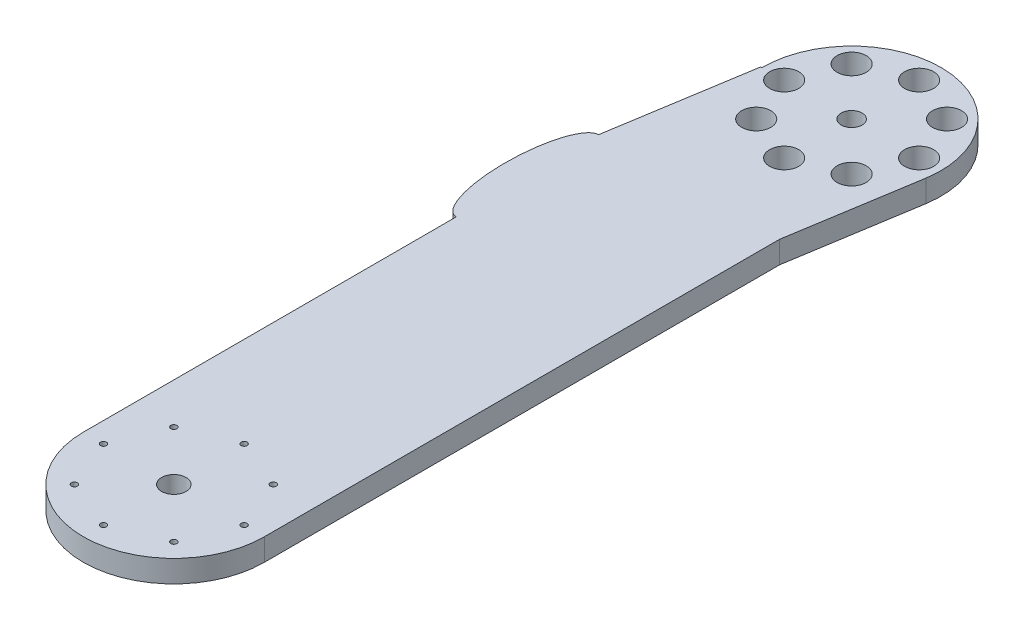
ISO-10303-21;
HEADER;
FILE_DESCRIPTION(('STEP AP214'),'2;1');
FILE_NAME('part.step','',(''),(''),'','','');
FILE_SCHEMA(('AUTOMOTIVE_DESIGN { 1 0 10303 214 1 1 1 1 }'));
ENDSEC;
DATA;
#1=APPLICATION_CONTEXT('core data for automotive mechanical design processes');
#2=APPLICATION_PROTOCOL_DEFINITION('international standard','automotive_design',2000,#1);
#3=PRODUCT_CONTEXT('',#1,'mechanical');
#4=PRODUCT('Part','Part','',(#3));
#5=PRODUCT_RELATED_PRODUCT_CATEGORY('part','',(#4));
#6=PRODUCT_DEFINITION_FORMATION('','',#4);
#7=PRODUCT_DEFINITION_CONTEXT('part definition',#1,'design');
#8=PRODUCT_DEFINITION('design','',#6,#7);
#9=PRODUCT_DEFINITION_SHAPE('','',#8);
#10=(LENGTH_UNIT() NAMED_UNIT(*) SI_UNIT(.MILLI.,.METRE.));
#11=(NAMED_UNIT(*) PLANE_ANGLE_UNIT() SI_UNIT($,.RADIAN.));
#12=(NAMED_UNIT(*) SI_UNIT($,.STERADIAN.) SOLID_ANGLE_UNIT());
#13=UNCERTAINTY_MEASURE_WITH_UNIT(LENGTH_MEASURE(1.E-05),#10,'distance_accuracy_value','');
#14=(GEOMETRIC_REPRESENTATION_CONTEXT(3) GLOBAL_UNCERTAINTY_ASSIGNED_CONTEXT((#13)) GLOBAL_UNIT_ASSIGNED_CONTEXT((#10,
#11,#12)) REPRESENTATION_CONTEXT('',''));
#15=CARTESIAN_POINT('',(0.,0.,0.));
#16=DIRECTION('',(0.,0.,1.));
#17=DIRECTION('',(1.,0.,0.));
#18=AXIS2_PLACEMENT_3D('',#15,#16,#17);
#19=CARTESIAN_POINT('',(-76.1303551224514,10.,-12.1984783831451));
#20=DIRECTION('',(-0.987404951490436,0.,-0.158213342585793));
#21=DIRECTION('',(-0.158213342585793,0.,0.987404951490436));
#22=AXIS2_PLACEMENT_3D('',#19,#20,#21);
#23=PLANE('',#22);
#24=DIRECTION('',(0.158213342585793,0.,-0.987404951490436));
#25=VECTOR('',#24,1.);
#26=CARTESIAN_POINT('',(-76.1303551224514,0.,-12.1984783831451));
#27=LINE('',#26,#25);
#28=CARTESIAN_POINT('',(-40.8421003802322,0.,-232.431468170518));
#29=VERTEX_POINT('',#28);
#30=CARTESIAN_POINT('',(-30.7509881499678,0.,-295.40981133273));
#31=VERTEX_POINT('',#30);
#32=EDGE_CURVE('E139',#29,#31,#27,.T.);
#33=ORIENTED_EDGE('',*,*,#32,.F.);
#34=DIRECTION('',(0.,-1.,0.));
#35=VECTOR('',#34,1.);
#36=CARTESIAN_POINT('',(-40.8421003802322,10.,-232.431468170518));
#37=LINE('',#36,#35);
#38=CARTESIAN_POINT('',(-40.8421003802322,10.,-232.431468170518));
#39=VERTEX_POINT('',#38);
#40=EDGE_CURVE('E11',#39,#29,#37,.T.);
#41=ORIENTED_EDGE('',*,*,#40,.F.);
#42=DIRECTION('',(0.158213342585793,0.,-0.987404951490436));
#43=VECTOR('',#42,1.);
#44=CARTESIAN_POINT('',(-76.1303551224514,10.,-12.1984783831451));
#45=LINE('',#44,#43);
#46=CARTESIAN_POINT('',(-30.7509881499678,10.,-295.40981133273));
#47=VERTEX_POINT('',#46);
#48=EDGE_CURVE('E165',#39,#47,#45,.T.);
#49=ORIENTED_EDGE('',*,*,#48,.T.);
#50=DIRECTION('',(0.,-1.,0.));
#51=VECTOR('',#50,1.);
#52=CARTESIAN_POINT('',(-30.7509881499678,10.,-295.40981133273));
#53=LINE('',#52,#51);
#54=EDGE_CURVE('E93',#47,#31,#53,.T.);
#55=ORIENTED_EDGE('',*,*,#54,.T.);
#56=EDGE_LOOP('',(#33,#41,#49,#55));
#57=FACE_BOUND('',#56,.T.);
#58=ADVANCED_FACE('F41',(#57),#23,.T.);
#59=CARTESIAN_POINT('',(-40.8421003802319,10.,-200.333095689061));
#60=DIRECTION('',(0.,1.,0.));
#61=DIRECTION('',(0.,0.,-1.));
#62=AXIS2_PLACEMENT_3D('',#59,#60,#61);
#63=ELLIPSE('',#62,32.0983724814568,10.0911122302643);
#64=DIRECTION('',(0.,-1.,0.));
#65=VECTOR('',#64,1.);
#66=SURFACE_OF_LINEAR_EXTRUSION('',#63,#65);
#67=CARTESIAN_POINT('',(-40.8421003802319,0.,-200.333095689061));
#68=DIRECTION('',(0.,1.,0.));
#69=DIRECTION('',(0.,0.,-1.));
#70=AXIS2_PLACEMENT_3D('',#67,#68,#69);
#71=ELLIPSE('',#70,32.0983724814568,10.0911122302643);
#72=CARTESIAN_POINT('',(-40.8421003802319,0.,-168.234723207604));
#73=VERTEX_POINT('',#72);
#74=EDGE_CURVE('E143',#29,#73,#71,.T.);
#75=ORIENTED_EDGE('',*,*,#74,.T.);
#76=DIRECTION('',(0.,-1.,0.));
#77=VECTOR('',#76,1.);
#78=CARTESIAN_POINT('',(-40.8421003802319,10.,-168.234723207604));
#79=LINE('',#78,#77);
#80=CARTESIAN_POINT('',(-40.8421003802319,10.,-168.234723207604));
#81=VERTEX_POINT('',#80);
#82=EDGE_CURVE('E50',#81,#73,#79,.T.);
#83=ORIENTED_EDGE('',*,*,#82,.F.);
#84=EDGE_CURVE('E206',#39,#81,#63,.T.);
#85=ORIENTED_EDGE('',*,*,#84,.F.);
#86=ORIENTED_EDGE('',*,*,#40,.T.);
#87=EDGE_LOOP('',(#75,#83,#85,#86));
#88=FACE_BOUND('',#87,.T.);
#89=ADVANCED_FACE('F188',(#88),#66,.F.);
#90=CARTESIAN_POINT('',(-40.8421003802319,10.,0.));
#91=DIRECTION('',(-1.,0.,0.));
#92=DIRECTION('',(0.,0.,1.));
#93=AXIS2_PLACEMENT_3D('',#90,#91,#92);
#94=PLANE('',#93);
#95=DIRECTION('',(0.,0.,-1.));
#96=VECTOR('',#95,1.);
#97=CARTESIAN_POINT('',(-40.8421003802319,0.,0.));
#98=LINE('',#97,#96);
#99=CARTESIAN_POINT('',(-40.8421003802319,0.,0.));
#100=VERTEX_POINT('',#99);
#101=EDGE_CURVE('E148',#100,#73,#98,.T.);
#102=ORIENTED_EDGE('',*,*,#101,.F.);
#103=DIRECTION('',(0.,-1.,0.));
#104=VECTOR('',#103,1.);
#105=CARTESIAN_POINT('',(-40.8421003802319,10.,0.));
#106=LINE('',#105,#104);
#107=CARTESIAN_POINT('',(-40.8421003802319,10.,0.));
#108=VERTEX_POINT('',#107);
#109=EDGE_CURVE('E176',#108,#100,#106,.T.);
#110=ORIENTED_EDGE('',*,*,#109,.F.);
#111=DIRECTION('',(0.,0.,-1.));
#112=VECTOR('',#111,1.);
#113=CARTESIAN_POINT('',(-40.8421003802319,10.,0.));
#114=LINE('',#113,#112);
#115=EDGE_CURVE('E185',#108,#81,#114,.T.);
#116=ORIENTED_EDGE('',*,*,#115,.T.);
#117=ORIENTED_EDGE('',*,*,#82,.T.);
#118=EDGE_LOOP('',(#102,#110,#116,#117));
#119=FACE_BOUND('',#118,.T.);
#120=ADVANCED_FACE('F183',(#119),#94,.T.);
#121=CARTESIAN_POINT('',(0.,10.,0.));
#122=DIRECTION('',(0.,-1.,0.));
#123=DIRECTION('',(0.,0.,-1.));
#124=AXIS2_PLACEMENT_3D('',#121,#122,#123);
#125=CYLINDRICAL_SURFACE('',#124,40.8421003802319);
#126=CARTESIAN_POINT('',(0.,0.,0.));
#127=DIRECTION('',(0.,1.,0.));
#128=DIRECTION('',(0.,0.,1.));
#129=AXIS2_PLACEMENT_3D('',#126,#127,#128);
#130=CIRCLE('',#129,40.8421003802319);
#131=CARTESIAN_POINT('',(40.8421003802319,0.,0.));
#132=VERTEX_POINT('',#131);
#133=EDGE_CURVE('E152',#100,#132,#130,.T.);
#134=ORIENTED_EDGE('',*,*,#133,.T.);
#135=DIRECTION('',(0.,-1.,0.));
#136=VECTOR('',#135,1.);
#137=CARTESIAN_POINT('',(40.8421003802319,10.,0.));
#138=LINE('',#137,#136);
#139=CARTESIAN_POINT('',(40.8421003802319,10.,0.));
#140=VERTEX_POINT('',#139);
#141=EDGE_CURVE('E172',#140,#132,#138,.T.);
#142=ORIENTED_EDGE('',*,*,#141,.F.);
#143=CARTESIAN_POINT('',(0.,10.,0.));
#144=DIRECTION('',(0.,1.,0.));
#145=DIRECTION('',(0.,0.,1.));
#146=AXIS2_PLACEMENT_3D('',#143,#144,#145);
#147=CIRCLE('',#146,40.8421003802319);
#148=EDGE_CURVE('E200',#108,#140,#147,.T.);
#149=ORIENTED_EDGE('',*,*,#148,.F.);
#150=ORIENTED_EDGE('',*,*,#109,.T.);
#151=EDGE_LOOP('',(#134,#142,#149,#150));
#152=FACE_BOUND('',#151,.T.);
#153=ADVANCED_FACE('F195',(#152),#125,.T.);
#154=CARTESIAN_POINT('',(40.8421003802319,10.,0.));
#155=DIRECTION('',(-1.,0.,0.));
#156=DIRECTION('',(0.,0.,1.));
#157=AXIS2_PLACEMENT_3D('',#154,#155,#156);
#158=PLANE('',#157);
#159=DIRECTION('',(0.,0.,-1.));
#160=VECTOR('',#159,1.);
#161=CARTESIAN_POINT('',(40.8421003802319,0.,0.));
#162=LINE('',#161,#160);
#163=CARTESIAN_POINT('',(40.8421003802319,0.,-232.431468170518));
#164=VERTEX_POINT('',#163);
#165=EDGE_CURVE('E155',#132,#164,#162,.T.);
#166=ORIENTED_EDGE('',*,*,#165,.T.);
#167=DIRECTION('',(0.,-1.,0.));
#168=VECTOR('',#167,1.);
#169=CARTESIAN_POINT('',(40.8421003802319,10.,-232.431468170518));
#170=LINE('',#169,#168);
#171=CARTESIAN_POINT('',(40.8421003802319,10.,-232.431468170518));
#172=VERTEX_POINT('',#171);
#173=EDGE_CURVE('E129',#172,#164,#170,.T.);
#174=ORIENTED_EDGE('',*,*,#173,.F.);
#175=DIRECTION('',(0.,0.,-1.));
#176=VECTOR('',#175,1.);
#177=CARTESIAN_POINT('',(40.8421003802319,10.,0.));
#178=LINE('',#177,#176);
#179=EDGE_CURVE('E118',#140,#172,#178,.T.);
#180=ORIENTED_EDGE('',*,*,#179,.F.);
#181=ORIENTED_EDGE('',*,*,#141,.T.);
#182=EDGE_LOOP('',(#166,#174,#180,#181));
#183=FACE_BOUND('',#182,.T.);
#184=ADVANCED_FACE('F198',(#183),#158,.F.);
#185=CARTESIAN_POINT('',(3.50917068928697,10.,0.562279562825913));
#186=DIRECTION('',(-0.987404951490436,0.,-0.158213342585793));
#187=DIRECTION('',(-0.158213342585793,0.,0.987404951490436));
#188=AXIS2_PLACEMENT_3D('',#185,#186,#187);
#189=PLANE('',#188);
#190=DIRECTION('',(0.158213342585793,0.,-0.987404951490436));
#191=VECTOR('',#190,1.);
#192=CARTESIAN_POINT('',(3.50917068928697,0.,0.562279562825913));
#193=LINE('',#192,#191);
#194=CARTESIAN_POINT('',(49.94474208855,0.,-289.240795042319));
#195=VERTEX_POINT('',#194);
#196=EDGE_CURVE('E127',#164,#195,#193,.T.);
#197=ORIENTED_EDGE('',*,*,#196,.T.);
#198=DIRECTION('',(0.,-1.,0.));
#199=VECTOR('',#198,1.);
#200=CARTESIAN_POINT('',(49.94474208855,10.,-289.240795042319));
#201=LINE('',#200,#199);
#202=CARTESIAN_POINT('',(49.94474208855,10.,-289.240795042319));
#203=VERTEX_POINT('',#202);
#204=EDGE_CURVE('E124',#203,#195,#201,.T.);
#205=ORIENTED_EDGE('',*,*,#204,.F.);
#206=DIRECTION('',(0.158213342585793,0.,-0.987404951490436));
#207=VECTOR('',#206,1.);
#208=CARTESIAN_POINT('',(3.50917068928697,10.,0.562279562825913));
#209=LINE('',#208,#207);
#210=EDGE_CURVE('E112',#172,#203,#209,.T.);
#211=ORIENTED_EDGE('',*,*,#210,.F.);
#212=ORIENTED_EDGE('',*,*,#173,.T.);
#213=EDGE_LOOP('',(#197,#205,#211,#212));
#214=FACE_BOUND('',#213,.T.);
#215=ADVANCED_FACE('F125',(#214),#189,.F.);
#216=CARTESIAN_POINT('',(10.1249791826809,10.,-295.621174015304));
#217=DIRECTION('',(0.,-1.,0.));
#218=DIRECTION('',(0.,0.,-1.));
#219=AXIS2_PLACEMENT_3D('',#216,#217,#218);
#220=CYLINDRICAL_SURFACE('',#219,40.3276921447104);
#221=CARTESIAN_POINT('',(10.1249791826809,0.,-295.621174015304));
#222=DIRECTION('',(0.,1.,0.));
#223=DIRECTION('',(0.,0.,1.));
#224=AXIS2_PLACEMENT_3D('',#221,#222,#223);
#225=CIRCLE('',#224,40.3276921447104);
#226=CARTESIAN_POINT('',(-30.2021738423287,0.,-295.412649158276));
#227=VERTEX_POINT('',#226);
#228=EDGE_CURVE('E86',#195,#227,#225,.T.);
#229=ORIENTED_EDGE('',*,*,#228,.T.);
#230=DIRECTION('',(0.,-1.,0.));
#231=VECTOR('',#230,1.);
#232=CARTESIAN_POINT('',(-30.2021738423287,10.,-295.412649158276));
#233=LINE('',#232,#231);
#234=CARTESIAN_POINT('',(-30.2021738423287,10.,-295.412649158276));
#235=VERTEX_POINT('',#234);
#236=EDGE_CURVE('E130',#235,#227,#233,.T.);
#237=ORIENTED_EDGE('',*,*,#236,.F.);
#238=CARTESIAN_POINT('',(10.1249791826809,10.,-295.621174015304));
#239=DIRECTION('',(0.,1.,0.));
#240=DIRECTION('',(0.,0.,1.));
#241=AXIS2_PLACEMENT_3D('',#238,#239,#240);
#242=CIRCLE('',#241,40.3276921447104);
#243=EDGE_CURVE('E116',#203,#235,#242,.T.);
#244=ORIENTED_EDGE('',*,*,#243,.F.);
#245=ORIENTED_EDGE('',*,*,#204,.T.);
#246=EDGE_LOOP('',(#229,#237,#244,#245));
#247=FACE_BOUND('',#246,.T.);
#248=ADVANCED_FACE('F132',(#247),#220,.T.);
#249=CARTESIAN_POINT('',(-1.52829528790367,10.,-295.560916912816));
#250=DIRECTION('',(0.00517076098183433,0.,0.999986631526076));
#251=DIRECTION('',(0.999986631526076,0.,-0.00517076098183433));
#252=AXIS2_PLACEMENT_3D('',#249,#250,#251);
#253=PLANE('',#252);
#254=DIRECTION('',(-0.999986631526076,0.,0.00517076098183433));
#255=VECTOR('',#254,1.);
#256=CARTESIAN_POINT('',(-1.52829528790367,0.,-295.560916912816));
#257=LINE('',#256,#255);
#258=EDGE_CURVE('E162',#227,#31,#257,.T.);
#259=ORIENTED_EDGE('',*,*,#258,.T.);
#260=ORIENTED_EDGE('',*,*,#54,.F.);
#261=DIRECTION('',(-0.999986631526076,0.,0.00517076098183433));
#262=VECTOR('',#261,1.);
#263=CARTESIAN_POINT('',(-1.52829528790367,10.,-295.560916912816));
#264=LINE('',#263,#262);
#265=EDGE_CURVE('E58',#235,#47,#264,.T.);
#266=ORIENTED_EDGE('',*,*,#265,.F.);
#267=ORIENTED_EDGE('',*,*,#236,.T.);
#268=EDGE_LOOP('',(#259,#260,#266,#267));
#269=FACE_BOUND('',#268,.T.);
#270=ADVANCED_FACE('F223',(#269),#253,.F.);
#271=CARTESIAN_POINT('',(0.,10.,0.));
#272=DIRECTION('',(0.,1.,0.));
#273=DIRECTION('',(0.,0.,1.));
#274=AXIS2_PLACEMENT_3D('',#271,#272,#273);
#275=PLANE('',#274);
#276=CARTESIAN_POINT('',(10.1249791826809,10.,-295.621174015304));
#277=DIRECTION('',(0.,1.,0.));
#278=DIRECTION('',(0.,0.,1.));
#279=AXIS2_PLACEMENT_3D('',#276,#277,#278);
#280=CIRCLE('',#279,4.72103877444645);
#281=CARTESIAN_POINT('',(10.1249791826809,10.,-290.900135240858));
#282=VERTEX_POINT('',#281);
#283=EDGE_CURVE('E451',#282,#282,#280,.T.);
#284=ORIENTED_EDGE('',*,*,#283,.F.);
#285=EDGE_LOOP('',(#284));
#286=FACE_BOUND('',#285,.T.);
#287=CARTESIAN_POINT('',(10.1249791826824,10.,-265.190659660924));
#288=DIRECTION('',(0.,1.,0.));
#289=DIRECTION('',(0.,0.,1.));
#290=AXIS2_PLACEMENT_3D('',#287,#288,#289);
#291=CIRCLE('',#290,6.56125005550479);
#292=CARTESIAN_POINT('',(10.1249791826824,10.,-258.62940960542));
#293=VERTEX_POINT('',#292);
#294=EDGE_CURVE('E391',#293,#293,#291,.T.);
#295=ORIENTED_EDGE('',*,*,#294,.F.);
#296=EDGE_LOOP('',(#295));
#297=FACE_BOUND('',#296,.T.);
#298=CARTESIAN_POINT('',(31.6426022376587,10.,-274.103550960328));
#299=DIRECTION('',(0.,1.,0.));
#300=DIRECTION('',(0.,0.,1.));
#301=AXIS2_PLACEMENT_3D('',#298,#299,#300);
#302=CIRCLE('',#301,6.5612500555048);
#303=CARTESIAN_POINT('',(31.6426022376587,10.,-267.542300904823));
#304=VERTEX_POINT('',#303);
#305=EDGE_CURVE('E399',#304,#304,#302,.T.);
#306=ORIENTED_EDGE('',*,*,#305,.F.);
#307=EDGE_LOOP('',(#306));
#308=FACE_BOUND('',#307,.T.);
#309=CARTESIAN_POINT('',(40.5554935370615,10.,-295.621174015305));
#310=DIRECTION('',(0.,1.,0.));
#311=DIRECTION('',(0.,0.,1.));
#312=AXIS2_PLACEMENT_3D('',#309,#310,#311);
#313=CIRCLE('',#312,6.56125005550481);
#314=CARTESIAN_POINT('',(40.5554935370615,10.,-289.0599239598));
#315=VERTEX_POINT('',#314);
#316=EDGE_CURVE('E407',#315,#315,#313,.T.);
#317=ORIENTED_EDGE('',*,*,#316,.F.);
#318=EDGE_LOOP('',(#317));
#319=FACE_BOUND('',#318,.T.);
#320=CARTESIAN_POINT('',(31.6426022376576,10.,-317.138797070281));
#321=DIRECTION('',(0.,1.,0.));
#322=DIRECTION('',(0.,0.,1.));
#323=AXIS2_PLACEMENT_3D('',#320,#321,#322);
#324=CIRCLE('',#323,6.5612500555048);
#325=CARTESIAN_POINT('',(31.6426022376576,10.,-310.577547014776));
#326=VERTEX_POINT('',#325);
#327=EDGE_CURVE('E415',#326,#326,#324,.T.);
#328=ORIENTED_EDGE('',*,*,#327,.F.);
#329=EDGE_LOOP('',(#328));
#330=FACE_BOUND('',#329,.T.);
#331=CARTESIAN_POINT('',(10.1249791826809,10.,-326.051688369684));
#332=DIRECTION('',(0.,1.,0.));
#333=DIRECTION('',(0.,0.,1.));
#334=AXIS2_PLACEMENT_3D('',#331,#332,#333);
#335=CIRCLE('',#334,6.56125005550479);
#336=CARTESIAN_POINT('',(10.1249791826809,10.,-319.490438314179));
#337=VERTEX_POINT('',#336);
#338=EDGE_CURVE('E423',#337,#337,#335,.T.);
#339=ORIENTED_EDGE('',*,*,#338,.F.);
#340=EDGE_LOOP('',(#339));
#341=FACE_BOUND('',#340,.T.);
#342=CARTESIAN_POINT('',(-20.3055351716979,10.,-295.621174015304));
#343=DIRECTION('',(0.,1.,0.));
#344=DIRECTION('',(0.,0.,1.));
#345=AXIS2_PLACEMENT_3D('',#342,#343,#344);
#346=CIRCLE('',#345,6.56125005550479);
#347=CARTESIAN_POINT('',(-20.3055351716979,10.,-289.059923959799));
#348=VERTEX_POINT('',#347);
#349=EDGE_CURVE('E431',#348,#348,#346,.T.);
#350=ORIENTED_EDGE('',*,*,#349,.F.);
#351=EDGE_LOOP('',(#350));
#352=FACE_BOUND('',#351,.T.);
#353=CARTESIAN_POINT('',(-11.3926438722943,10.,-274.103550960327));
#354=DIRECTION('',(0.,1.,0.));
#355=DIRECTION('',(0.,0.,1.));
#356=AXIS2_PLACEMENT_3D('',#353,#354,#355);
#357=CIRCLE('',#356,6.56125005550478);
#358=CARTESIAN_POINT('',(-11.3926438722943,10.,-267.542300904823));
#359=VERTEX_POINT('',#358);
#360=EDGE_CURVE('E439',#359,#359,#357,.T.);
#361=ORIENTED_EDGE('',*,*,#360,.F.);
#362=EDGE_LOOP('',(#361));
#363=FACE_BOUND('',#362,.T.);
#364=CARTESIAN_POINT('',(-11.392643872295,10.,-317.13879707028));
#365=DIRECTION('',(0.,1.,0.));
#366=DIRECTION('',(0.,0.,1.));
#367=AXIS2_PLACEMENT_3D('',#364,#365,#366);
#368=CIRCLE('',#367,6.56125005550482);
#369=CARTESIAN_POINT('',(-11.392643872295,10.,-310.577547014775));
#370=VERTEX_POINT('',#369);
#371=EDGE_CURVE('E387',#370,#370,#368,.T.);
#372=ORIENTED_EDGE('',*,*,#371,.F.);
#373=EDGE_LOOP('',(#372));
#374=FACE_BOUND('',#373,.T.);
#375=CARTESIAN_POINT('',(0.,10.,0.));
#376=DIRECTION('',(0.,1.,0.));
#377=DIRECTION('',(0.,0.,1.));
#378=AXIS2_PLACEMENT_3D('',#375,#376,#377);
#379=CIRCLE('',#378,5.5);
#380=CARTESIAN_POINT('',(0.,10.,5.5));
#381=VERTEX_POINT('',#380);
#382=EDGE_CURVE('E379',#381,#381,#379,.T.);
#383=ORIENTED_EDGE('',*,*,#382,.F.);
#384=EDGE_LOOP('',(#383));
#385=FACE_BOUND('',#384,.T.);
#386=CARTESIAN_POINT('',(0.,10.,-31.7167556330264));
#387=DIRECTION('',(0.,1.,0.));
#388=DIRECTION('',(0.,0.,1.));
#389=AXIS2_PLACEMENT_3D('',#386,#387,#388);
#390=CIRCLE('',#389,1.35);
#391=CARTESIAN_POINT('',(0.,10.,-30.3667556330264));
#392=VERTEX_POINT('',#391);
#393=EDGE_CURVE('E316',#392,#392,#390,.F.);
#394=ORIENTED_EDGE('',*,*,#393,.T.);
#395=EDGE_LOOP('',(#394));
#396=FACE_BOUND('',#395,.T.);
#397=CARTESIAN_POINT('',(-22.4271329853496,10.,-22.4271329853496));
#398=DIRECTION('',(0.,1.,0.));
#399=DIRECTION('',(0.,0.,1.));
#400=AXIS2_PLACEMENT_3D('',#397,#398,#399);
#401=CIRCLE('',#400,1.35);
#402=CARTESIAN_POINT('',(-22.4271329853496,10.,-21.0771329853496));
#403=VERTEX_POINT('',#402);
#404=EDGE_CURVE('E324',#403,#403,#401,.F.);
#405=ORIENTED_EDGE('',*,*,#404,.T.);
#406=EDGE_LOOP('',(#405));
#407=FACE_BOUND('',#406,.T.);
#408=CARTESIAN_POINT('',(-31.7167556330264,10.,1.10738460421359E-13));
#409=DIRECTION('',(0.,1.,0.));
#410=DIRECTION('',(0.,0.,1.));
#411=AXIS2_PLACEMENT_3D('',#408,#409,#410);
#412=CIRCLE('',#411,1.35);
#413=CARTESIAN_POINT('',(-31.7167556330264,10.,1.35000000000011));
#414=VERTEX_POINT('',#413);
#415=EDGE_CURVE('E332',#414,#414,#412,.F.);
#416=ORIENTED_EDGE('',*,*,#415,.T.);
#417=EDGE_LOOP('',(#416));
#418=FACE_BOUND('',#417,.T.);
#419=CARTESIAN_POINT('',(-22.4271329853495,10.,22.4271329853497));
#420=DIRECTION('',(0.,1.,0.));
#421=DIRECTION('',(0.,0.,1.));
#422=AXIS2_PLACEMENT_3D('',#419,#420,#421);
#423=CIRCLE('',#422,1.35);
#424=CARTESIAN_POINT('',(-22.4271329853495,10.,23.7771329853497));
#425=VERTEX_POINT('',#424);
#426=EDGE_CURVE('E340',#425,#425,#423,.F.);
#427=ORIENTED_EDGE('',*,*,#426,.T.);
#428=EDGE_LOOP('',(#427));
#429=FACE_BOUND('',#428,.T.);
#430=CARTESIAN_POINT('',(2.21476920842719E-13,10.,31.7167556330264));
#431=DIRECTION('',(0.,1.,0.));
#432=DIRECTION('',(0.,0.,1.));
#433=AXIS2_PLACEMENT_3D('',#430,#431,#432);
#434=CIRCLE('',#433,1.35);
#435=CARTESIAN_POINT('',(2.21476920842719E-13,10.,33.0667556330264));
#436=VERTEX_POINT('',#435);
#437=EDGE_CURVE('E348',#436,#436,#434,.F.);
#438=ORIENTED_EDGE('',*,*,#437,.T.);
#439=EDGE_LOOP('',(#438));
#440=FACE_BOUND('',#439,.T.);
#441=CARTESIAN_POINT('',(22.4271329853498,10.,22.4271329853494));
#442=DIRECTION('',(0.,1.,0.));
#443=DIRECTION('',(0.,0.,1.));
#444=AXIS2_PLACEMENT_3D('',#441,#442,#443);
#445=CIRCLE('',#444,1.35);
#446=CARTESIAN_POINT('',(22.4271329853498,10.,23.7771329853494));
#447=VERTEX_POINT('',#446);
#448=EDGE_CURVE('E356',#447,#447,#445,.F.);
#449=ORIENTED_EDGE('',*,*,#448,.T.);
#450=EDGE_LOOP('',(#449));
#451=FACE_BOUND('',#450,.T.);
#452=CARTESIAN_POINT('',(31.7167556330264,10.,-3.32215381264078E-13));
#453=DIRECTION('',(0.,1.,0.));
#454=DIRECTION('',(0.,0.,1.));
#455=AXIS2_PLACEMENT_3D('',#452,#453,#454);
#456=CIRCLE('',#455,1.35);
#457=CARTESIAN_POINT('',(31.7167556330264,10.,1.34999999999967));
#458=VERTEX_POINT('',#457);
#459=EDGE_CURVE('E364',#458,#458,#456,.F.);
#460=ORIENTED_EDGE('',*,*,#459,.T.);
#461=EDGE_LOOP('',(#460));
#462=FACE_BOUND('',#461,.T.);
#463=CARTESIAN_POINT('',(22.4271329853493,10.,-22.4271329853499));
#464=DIRECTION('',(0.,1.,0.));
#465=DIRECTION('',(0.,0.,1.));
#466=AXIS2_PLACEMENT_3D('',#463,#464,#465);
#467=CIRCLE('',#466,1.35);
#468=CARTESIAN_POINT('',(22.4271329853493,10.,-21.0771329853499));
#469=VERTEX_POINT('',#468);
#470=EDGE_CURVE('E372',#469,#469,#467,.F.);
#471=ORIENTED_EDGE('',*,*,#470,.T.);
#472=EDGE_LOOP('',(#471));
#473=FACE_BOUND('',#472,.T.);
#474=ORIENTED_EDGE('',*,*,#48,.F.);
#475=ORIENTED_EDGE('',*,*,#84,.T.);
#476=ORIENTED_EDGE('',*,*,#115,.F.);
#477=ORIENTED_EDGE('',*,*,#148,.T.);
#478=ORIENTED_EDGE('',*,*,#179,.T.);
#479=ORIENTED_EDGE('',*,*,#210,.T.);
#480=ORIENTED_EDGE('',*,*,#243,.T.);
#481=ORIENTED_EDGE('',*,*,#265,.T.);
#482=EDGE_LOOP('',(#474,#475,#476,#477,#478,#479,#480,#481));
#483=FACE_BOUND('',#482,.T.);
#484=ADVANCED_FACE('F114',(#286,#297,#308,#319,#330,#341,#352,#363,#374,#385,#396,#407,#418,
#429,#440,#451,#462,#473,#483),#275,.T.);
#485=CARTESIAN_POINT('',(0.,0.,0.));
#486=DIRECTION('',(0.,1.,0.));
#487=DIRECTION('',(0.,0.,1.));
#488=AXIS2_PLACEMENT_3D('',#485,#486,#487);
#489=PLANE('',#488);
#490=CARTESIAN_POINT('',(10.1249791826809,0.,-295.621174015304));
#491=DIRECTION('',(0.,1.,0.));
#492=DIRECTION('',(0.,0.,1.));
#493=AXIS2_PLACEMENT_3D('',#490,#491,#492);
#494=CIRCLE('',#493,4.72103877444645);
#495=CARTESIAN_POINT('',(10.1249791826809,0.,-290.900135240858));
#496=VERTEX_POINT('',#495);
#497=EDGE_CURVE('E447',#496,#496,#494,.F.);
#498=ORIENTED_EDGE('',*,*,#497,.F.);
#499=EDGE_LOOP('',(#498));
#500=FACE_BOUND('',#499,.T.);
#501=CARTESIAN_POINT('',(10.1249791826824,0.,-265.190659660924));
#502=DIRECTION('',(0.,1.,0.));
#503=DIRECTION('',(0.,0.,1.));
#504=AXIS2_PLACEMENT_3D('',#501,#502,#503);
#505=CIRCLE('',#504,6.56125005550479);
#506=CARTESIAN_POINT('',(10.1249791826824,0.,-258.62940960542));
#507=VERTEX_POINT('',#506);
#508=EDGE_CURVE('E395',#507,#507,#505,.F.);
#509=ORIENTED_EDGE('',*,*,#508,.F.);
#510=EDGE_LOOP('',(#509));
#511=FACE_BOUND('',#510,.T.);
#512=CARTESIAN_POINT('',(31.6426022376587,0.,-274.103550960328));
#513=DIRECTION('',(0.,1.,0.));
#514=DIRECTION('',(0.,0.,1.));
#515=AXIS2_PLACEMENT_3D('',#512,#513,#514);
#516=CIRCLE('',#515,6.5612500555048);
#517=CARTESIAN_POINT('',(31.6426022376587,0.,-267.542300904823));
#518=VERTEX_POINT('',#517);
#519=EDGE_CURVE('E403',#518,#518,#516,.F.);
#520=ORIENTED_EDGE('',*,*,#519,.F.);
#521=EDGE_LOOP('',(#520));
#522=FACE_BOUND('',#521,.T.);
#523=CARTESIAN_POINT('',(40.5554935370615,0.,-295.621174015305));
#524=DIRECTION('',(0.,1.,0.));
#525=DIRECTION('',(0.,0.,1.));
#526=AXIS2_PLACEMENT_3D('',#523,#524,#525);
#527=CIRCLE('',#526,6.56125005550481);
#528=CARTESIAN_POINT('',(40.5554935370615,0.,-289.0599239598));
#529=VERTEX_POINT('',#528);
#530=EDGE_CURVE('E411',#529,#529,#527,.F.);
#531=ORIENTED_EDGE('',*,*,#530,.F.);
#532=EDGE_LOOP('',(#531));
#533=FACE_BOUND('',#532,.T.);
#534=CARTESIAN_POINT('',(31.6426022376576,0.,-317.138797070281));
#535=DIRECTION('',(0.,1.,0.));
#536=DIRECTION('',(0.,0.,1.));
#537=AXIS2_PLACEMENT_3D('',#534,#535,#536);
#538=CIRCLE('',#537,6.5612500555048);
#539=CARTESIAN_POINT('',(31.6426022376576,0.,-310.577547014776));
#540=VERTEX_POINT('',#539);
#541=EDGE_CURVE('E419',#540,#540,#538,.F.);
#542=ORIENTED_EDGE('',*,*,#541,.F.);
#543=EDGE_LOOP('',(#542));
#544=FACE_BOUND('',#543,.T.);
#545=CARTESIAN_POINT('',(10.1249791826809,0.,-326.051688369684));
#546=DIRECTION('',(0.,1.,0.));
#547=DIRECTION('',(0.,0.,1.));
#548=AXIS2_PLACEMENT_3D('',#545,#546,#547);
#549=CIRCLE('',#548,6.56125005550479);
#550=CARTESIAN_POINT('',(10.1249791826809,0.,-319.490438314179));
#551=VERTEX_POINT('',#550);
#552=EDGE_CURVE('E427',#551,#551,#549,.F.);
#553=ORIENTED_EDGE('',*,*,#552,.F.);
#554=EDGE_LOOP('',(#553));
#555=FACE_BOUND('',#554,.T.);
#556=CARTESIAN_POINT('',(-20.3055351716979,0.,-295.621174015304));
#557=DIRECTION('',(0.,1.,0.));
#558=DIRECTION('',(0.,0.,1.));
#559=AXIS2_PLACEMENT_3D('',#556,#557,#558);
#560=CIRCLE('',#559,6.56125005550479);
#561=CARTESIAN_POINT('',(-20.3055351716979,0.,-289.059923959799));
#562=VERTEX_POINT('',#561);
#563=EDGE_CURVE('E435',#562,#562,#560,.F.);
#564=ORIENTED_EDGE('',*,*,#563,.F.);
#565=EDGE_LOOP('',(#564));
#566=FACE_BOUND('',#565,.T.);
#567=CARTESIAN_POINT('',(-11.3926438722943,0.,-274.103550960327));
#568=DIRECTION('',(0.,1.,0.));
#569=DIRECTION('',(0.,0.,1.));
#570=AXIS2_PLACEMENT_3D('',#567,#568,#569);
#571=CIRCLE('',#570,6.56125005550478);
#572=CARTESIAN_POINT('',(-11.3926438722943,0.,-267.542300904823));
#573=VERTEX_POINT('',#572);
#574=EDGE_CURVE('E443',#573,#573,#571,.F.);
#575=ORIENTED_EDGE('',*,*,#574,.F.);
#576=EDGE_LOOP('',(#575));
#577=FACE_BOUND('',#576,.T.);
#578=CARTESIAN_POINT('',(-11.392643872295,0.,-317.13879707028));
#579=DIRECTION('',(0.,1.,0.));
#580=DIRECTION('',(0.,0.,1.));
#581=AXIS2_PLACEMENT_3D('',#578,#579,#580);
#582=CIRCLE('',#581,6.56125005550482);
#583=CARTESIAN_POINT('',(-11.392643872295,0.,-310.577547014775));
#584=VERTEX_POINT('',#583);
#585=EDGE_CURVE('E383',#584,#584,#582,.F.);
#586=ORIENTED_EDGE('',*,*,#585,.F.);
#587=EDGE_LOOP('',(#586));
#588=FACE_BOUND('',#587,.T.);
#589=CARTESIAN_POINT('',(0.,0.,0.));
#590=DIRECTION('',(0.,1.,0.));
#591=DIRECTION('',(0.,0.,1.));
#592=AXIS2_PLACEMENT_3D('',#589,#590,#591);
#593=CIRCLE('',#592,5.5);
#594=CARTESIAN_POINT('',(0.,0.,5.5));
#595=VERTEX_POINT('',#594);
#596=EDGE_CURVE('E376',#595,#595,#593,.F.);
#597=ORIENTED_EDGE('',*,*,#596,.F.);
#598=EDGE_LOOP('',(#597));
#599=FACE_BOUND('',#598,.T.);
#600=CARTESIAN_POINT('',(0.,0.,-31.7167556330264));
#601=DIRECTION('',(0.,-1.,0.));
#602=DIRECTION('',(0.,0.,-1.));
#603=AXIS2_PLACEMENT_3D('',#600,#601,#602);
#604=CIRCLE('',#603,1.35);
#605=CARTESIAN_POINT('',(0.,0.,-33.0667556330264));
#606=VERTEX_POINT('',#605);
#607=EDGE_CURVE('E144',#606,#606,#604,.T.);
#608=ORIENTED_EDGE('',*,*,#607,.F.);
#609=EDGE_LOOP('',(#608));
#610=FACE_BOUND('',#609,.T.);
#611=CARTESIAN_POINT('',(-22.4271329853496,0.,-22.4271329853496));
#612=DIRECTION('',(0.,-1.,0.));
#613=DIRECTION('',(0.,0.,-1.));
#614=AXIS2_PLACEMENT_3D('',#611,#612,#613);
#615=CIRCLE('',#614,1.35);
#616=CARTESIAN_POINT('',(-22.4271329853496,0.,-23.7771329853496));
#617=VERTEX_POINT('',#616);
#618=EDGE_CURVE('E320',#617,#617,#615,.T.);
#619=ORIENTED_EDGE('',*,*,#618,.F.);
#620=EDGE_LOOP('',(#619));
#621=FACE_BOUND('',#620,.T.);
#622=CARTESIAN_POINT('',(-31.7167556330264,0.,1.10738460421359E-13));
#623=DIRECTION('',(0.,-1.,0.));
#624=DIRECTION('',(0.,0.,-1.));
#625=AXIS2_PLACEMENT_3D('',#622,#623,#624);
#626=CIRCLE('',#625,1.35);
#627=CARTESIAN_POINT('',(-31.7167556330264,0.,-1.34999999999989));
#628=VERTEX_POINT('',#627);
#629=EDGE_CURVE('E328',#628,#628,#626,.T.);
#630=ORIENTED_EDGE('',*,*,#629,.F.);
#631=EDGE_LOOP('',(#630));
#632=FACE_BOUND('',#631,.T.);
#633=CARTESIAN_POINT('',(-22.4271329853495,0.,22.4271329853497));
#634=DIRECTION('',(0.,-1.,0.));
#635=DIRECTION('',(0.,0.,-1.));
#636=AXIS2_PLACEMENT_3D('',#633,#634,#635);
#637=CIRCLE('',#636,1.35);
#638=CARTESIAN_POINT('',(-22.4271329853495,0.,21.0771329853497));
#639=VERTEX_POINT('',#638);
#640=EDGE_CURVE('E336',#639,#639,#637,.T.);
#641=ORIENTED_EDGE('',*,*,#640,.F.);
#642=EDGE_LOOP('',(#641));
#643=FACE_BOUND('',#642,.T.);
#644=CARTESIAN_POINT('',(2.21476920842719E-13,0.,31.7167556330264));
#645=DIRECTION('',(0.,-1.,0.));
#646=DIRECTION('',(0.,0.,-1.));
#647=AXIS2_PLACEMENT_3D('',#644,#645,#646);
#648=CIRCLE('',#647,1.35);
#649=CARTESIAN_POINT('',(2.21476920842719E-13,0.,30.3667556330264));
#650=VERTEX_POINT('',#649);
#651=EDGE_CURVE('E344',#650,#650,#648,.T.);
#652=ORIENTED_EDGE('',*,*,#651,.F.);
#653=EDGE_LOOP('',(#652));
#654=FACE_BOUND('',#653,.T.);
#655=CARTESIAN_POINT('',(22.4271329853498,0.,22.4271329853494));
#656=DIRECTION('',(0.,-1.,0.));
#657=DIRECTION('',(0.,0.,-1.));
#658=AXIS2_PLACEMENT_3D('',#655,#656,#657);
#659=CIRCLE('',#658,1.35);
#660=CARTESIAN_POINT('',(22.4271329853498,0.,21.0771329853494));
#661=VERTEX_POINT('',#660);
#662=EDGE_CURVE('E352',#661,#661,#659,.T.);
#663=ORIENTED_EDGE('',*,*,#662,.F.);
#664=EDGE_LOOP('',(#663));
#665=FACE_BOUND('',#664,.T.);
#666=CARTESIAN_POINT('',(31.7167556330264,0.,-3.32215381264078E-13));
#667=DIRECTION('',(0.,-1.,0.));
#668=DIRECTION('',(0.,0.,-1.));
#669=AXIS2_PLACEMENT_3D('',#666,#667,#668);
#670=CIRCLE('',#669,1.35);
#671=CARTESIAN_POINT('',(31.7167556330264,0.,-1.35000000000033));
#672=VERTEX_POINT('',#671);
#673=EDGE_CURVE('E360',#672,#672,#670,.T.);
#674=ORIENTED_EDGE('',*,*,#673,.F.);
#675=EDGE_LOOP('',(#674));
#676=FACE_BOUND('',#675,.T.);
#677=CARTESIAN_POINT('',(22.4271329853493,0.,-22.4271329853499));
#678=DIRECTION('',(0.,-1.,0.));
#679=DIRECTION('',(0.,0.,-1.));
#680=AXIS2_PLACEMENT_3D('',#677,#678,#679);
#681=CIRCLE('',#680,1.35);
#682=CARTESIAN_POINT('',(22.4271329853493,0.,-23.7771329853499));
#683=VERTEX_POINT('',#682);
#684=EDGE_CURVE('E368',#683,#683,#681,.T.);
#685=ORIENTED_EDGE('',*,*,#684,.F.);
#686=EDGE_LOOP('',(#685));
#687=FACE_BOUND('',#686,.T.);
#688=ORIENTED_EDGE('',*,*,#32,.T.);
#689=ORIENTED_EDGE('',*,*,#258,.F.);
#690=ORIENTED_EDGE('',*,*,#228,.F.);
#691=ORIENTED_EDGE('',*,*,#196,.F.);
#692=ORIENTED_EDGE('',*,*,#165,.F.);
#693=ORIENTED_EDGE('',*,*,#133,.F.);
#694=ORIENTED_EDGE('',*,*,#101,.T.);
#695=ORIENTED_EDGE('',*,*,#74,.F.);
#696=EDGE_LOOP('',(#688,#689,#690,#691,#692,#693,#694,#695));
#697=FACE_BOUND('',#696,.T.);
#698=ADVANCED_FACE('F191',(#500,#511,#522,#533,#544,#555,#566,#577,#588,#599,#610,#621,#632,
#643,#654,#665,#676,#687,#697),#489,.F.);
#699=CARTESIAN_POINT('',(22.4271329853493,10.001,-22.4271329853499));
#700=DIRECTION('',(0.,-1.,0.));
#701=DIRECTION('',(0.,0.,-1.));
#702=AXIS2_PLACEMENT_3D('',#699,#700,#701);
#703=CYLINDRICAL_SURFACE('',#702,1.35);
#704=ORIENTED_EDGE('',*,*,#470,.F.);
#705=EDGE_LOOP('',(#704));
#706=FACE_BOUND('',#705,.T.);
#707=ORIENTED_EDGE('',*,*,#684,.T.);
#708=EDGE_LOOP('',(#707));
#709=FACE_BOUND('',#708,.T.);
#710=ADVANCED_FACE('F229',(#706,#709),#703,.F.);
#711=CARTESIAN_POINT('',(31.7167556330264,10.001,-3.32215381264078E-13));
#712=DIRECTION('',(0.,-1.,0.));
#713=DIRECTION('',(0.,0.,-1.));
#714=AXIS2_PLACEMENT_3D('',#711,#712,#713);
#715=CYLINDRICAL_SURFACE('',#714,1.35);
#716=ORIENTED_EDGE('',*,*,#459,.F.);
#717=EDGE_LOOP('',(#716));
#718=FACE_BOUND('',#717,.T.);
#719=ORIENTED_EDGE('',*,*,#673,.T.);
#720=EDGE_LOOP('',(#719));
#721=FACE_BOUND('',#720,.T.);
#722=ADVANCED_FACE('F236',(#718,#721),#715,.F.);
#723=CARTESIAN_POINT('',(22.4271329853498,10.001,22.4271329853494));
#724=DIRECTION('',(0.,-1.,0.));
#725=DIRECTION('',(0.,0.,-1.));
#726=AXIS2_PLACEMENT_3D('',#723,#724,#725);
#727=CYLINDRICAL_SURFACE('',#726,1.35);
#728=ORIENTED_EDGE('',*,*,#448,.F.);
#729=EDGE_LOOP('',(#728));
#730=FACE_BOUND('',#729,.T.);
#731=ORIENTED_EDGE('',*,*,#662,.T.);
#732=EDGE_LOOP('',(#731));
#733=FACE_BOUND('',#732,.T.);
#734=ADVANCED_FACE('F240',(#730,#733),#727,.F.);
#735=CARTESIAN_POINT('',(2.21476920842719E-13,10.001,31.7167556330264));
#736=DIRECTION('',(0.,-1.,0.));
#737=DIRECTION('',(0.,0.,-1.));
#738=AXIS2_PLACEMENT_3D('',#735,#736,#737);
#739=CYLINDRICAL_SURFACE('',#738,1.35);
#740=ORIENTED_EDGE('',*,*,#437,.F.);
#741=EDGE_LOOP('',(#740));
#742=FACE_BOUND('',#741,.T.);
#743=ORIENTED_EDGE('',*,*,#651,.T.);
#744=EDGE_LOOP('',(#743));
#745=FACE_BOUND('',#744,.T.);
#746=ADVANCED_FACE('F244',(#742,#745),#739,.F.);
#747=CARTESIAN_POINT('',(-22.4271329853495,10.001,22.4271329853497));
#748=DIRECTION('',(0.,-1.,0.));
#749=DIRECTION('',(0.,0.,-1.));
#750=AXIS2_PLACEMENT_3D('',#747,#748,#749);
#751=CYLINDRICAL_SURFACE('',#750,1.35);
#752=ORIENTED_EDGE('',*,*,#426,.F.);
#753=EDGE_LOOP('',(#752));
#754=FACE_BOUND('',#753,.T.);
#755=ORIENTED_EDGE('',*,*,#640,.T.);
#756=EDGE_LOOP('',(#755));
#757=FACE_BOUND('',#756,.T.);
#758=ADVANCED_FACE('F248',(#754,#757),#751,.F.);
#759=CARTESIAN_POINT('',(-31.7167556330264,10.001,1.10738460421359E-13));
#760=DIRECTION('',(0.,-1.,0.));
#761=DIRECTION('',(0.,0.,-1.));
#762=AXIS2_PLACEMENT_3D('',#759,#760,#761);
#763=CYLINDRICAL_SURFACE('',#762,1.35);
#764=ORIENTED_EDGE('',*,*,#415,.F.);
#765=EDGE_LOOP('',(#764));
#766=FACE_BOUND('',#765,.T.);
#767=ORIENTED_EDGE('',*,*,#629,.T.);
#768=EDGE_LOOP('',(#767));
#769=FACE_BOUND('',#768,.T.);
#770=ADVANCED_FACE('F252',(#766,#769),#763,.F.);
#771=CARTESIAN_POINT('',(-22.4271329853496,10.001,-22.4271329853496));
#772=DIRECTION('',(0.,-1.,0.));
#773=DIRECTION('',(0.,0.,-1.));
#774=AXIS2_PLACEMENT_3D('',#771,#772,#773);
#775=CYLINDRICAL_SURFACE('',#774,1.35);
#776=ORIENTED_EDGE('',*,*,#404,.F.);
#777=EDGE_LOOP('',(#776));
#778=FACE_BOUND('',#777,.T.);
#779=ORIENTED_EDGE('',*,*,#618,.T.);
#780=EDGE_LOOP('',(#779));
#781=FACE_BOUND('',#780,.T.);
#782=ADVANCED_FACE('F256',(#778,#781),#775,.F.);
#783=CARTESIAN_POINT('',(0.,10.001,-31.7167556330264));
#784=DIRECTION('',(0.,-1.,0.));
#785=DIRECTION('',(0.,0.,-1.));
#786=AXIS2_PLACEMENT_3D('',#783,#784,#785);
#787=CYLINDRICAL_SURFACE('',#786,1.35);
#788=ORIENTED_EDGE('',*,*,#393,.F.);
#789=EDGE_LOOP('',(#788));
#790=FACE_BOUND('',#789,.T.);
#791=ORIENTED_EDGE('',*,*,#607,.T.);
#792=EDGE_LOOP('',(#791));
#793=FACE_BOUND('',#792,.T.);
#794=ADVANCED_FACE('F260',(#790,#793),#787,.F.);
#795=CARTESIAN_POINT('',(0.,-0.000999999999999265,0.));
#796=DIRECTION('',(0.,1.,0.));
#797=DIRECTION('',(0.,0.,1.));
#798=AXIS2_PLACEMENT_3D('',#795,#796,#797);
#799=CYLINDRICAL_SURFACE('',#798,5.5);
#800=ORIENTED_EDGE('',*,*,#382,.T.);
#801=EDGE_LOOP('',(#800));
#802=FACE_BOUND('',#801,.T.);
#803=ORIENTED_EDGE('',*,*,#596,.T.);
#804=EDGE_LOOP('',(#803));
#805=FACE_BOUND('',#804,.T.);
#806=ADVANCED_FACE('F264',(#802,#805),#799,.F.);
#807=CARTESIAN_POINT('',(-11.392643872295,-0.000999999999999265,-317.13879707028));
#808=DIRECTION('',(0.,1.,0.));
#809=DIRECTION('',(0.,0.,1.));
#810=AXIS2_PLACEMENT_3D('',#807,#808,#809);
#811=CYLINDRICAL_SURFACE('',#810,6.56125005550482);
#812=ORIENTED_EDGE('',*,*,#371,.T.);
#813=EDGE_LOOP('',(#812));
#814=FACE_BOUND('',#813,.T.);
#815=ORIENTED_EDGE('',*,*,#585,.T.);
#816=EDGE_LOOP('',(#815));
#817=FACE_BOUND('',#816,.T.);
#818=ADVANCED_FACE('F268',(#814,#817),#811,.F.);
#819=CARTESIAN_POINT('',(-11.3926438722943,-0.000999999999999265,-274.103550960327));
#820=DIRECTION('',(0.,1.,0.));
#821=DIRECTION('',(0.,0.,1.));
#822=AXIS2_PLACEMENT_3D('',#819,#820,#821);
#823=CYLINDRICAL_SURFACE('',#822,6.56125005550478);
#824=ORIENTED_EDGE('',*,*,#360,.T.);
#825=EDGE_LOOP('',(#824));
#826=FACE_BOUND('',#825,.T.);
#827=ORIENTED_EDGE('',*,*,#574,.T.);
#828=EDGE_LOOP('',(#827));
#829=FACE_BOUND('',#828,.T.);
#830=ADVANCED_FACE('F272',(#826,#829),#823,.F.);
#831=CARTESIAN_POINT('',(-20.3055351716979,-0.000999999999999265,-295.621174015304));
#832=DIRECTION('',(0.,1.,0.));
#833=DIRECTION('',(0.,0.,1.));
#834=AXIS2_PLACEMENT_3D('',#831,#832,#833);
#835=CYLINDRICAL_SURFACE('',#834,6.56125005550479);
#836=ORIENTED_EDGE('',*,*,#349,.T.);
#837=EDGE_LOOP('',(#836));
#838=FACE_BOUND('',#837,.T.);
#839=ORIENTED_EDGE('',*,*,#563,.T.);
#840=EDGE_LOOP('',(#839));
#841=FACE_BOUND('',#840,.T.);
#842=ADVANCED_FACE('F294',(#838,#841),#835,.F.);
#843=CARTESIAN_POINT('',(10.1249791826809,-0.000999999999999265,-326.051688369684));
#844=DIRECTION('',(0.,1.,0.));
#845=DIRECTION('',(0.,0.,1.));
#846=AXIS2_PLACEMENT_3D('',#843,#844,#845);
#847=CYLINDRICAL_SURFACE('',#846,6.56125005550479);
#848=ORIENTED_EDGE('',*,*,#338,.T.);
#849=EDGE_LOOP('',(#848));
#850=FACE_BOUND('',#849,.T.);
#851=ORIENTED_EDGE('',*,*,#552,.T.);
#852=EDGE_LOOP('',(#851));
#853=FACE_BOUND('',#852,.T.);
#854=ADVANCED_FACE('F278',(#850,#853),#847,.F.);
#855=CARTESIAN_POINT('',(31.6426022376576,-0.000999999999999265,-317.138797070281));
#856=DIRECTION('',(0.,1.,0.));
#857=DIRECTION('',(0.,0.,1.));
#858=AXIS2_PLACEMENT_3D('',#855,#856,#857);
#859=CYLINDRICAL_SURFACE('',#858,6.5612500555048);
#860=ORIENTED_EDGE('',*,*,#327,.T.);
#861=EDGE_LOOP('',(#860));
#862=FACE_BOUND('',#861,.T.);
#863=ORIENTED_EDGE('',*,*,#541,.T.);
#864=EDGE_LOOP('',(#863));
#865=FACE_BOUND('',#864,.T.);
#866=ADVANCED_FACE('F274',(#862,#865),#859,.F.);
#867=CARTESIAN_POINT('',(40.5554935370615,-0.000999999999999265,-295.621174015305));
#868=DIRECTION('',(0.,1.,0.));
#869=DIRECTION('',(0.,0.,1.));
#870=AXIS2_PLACEMENT_3D('',#867,#868,#869);
#871=CYLINDRICAL_SURFACE('',#870,6.56125005550481);
#872=ORIENTED_EDGE('',*,*,#316,.T.);
#873=EDGE_LOOP('',(#872));
#874=FACE_BOUND('',#873,.T.);
#875=ORIENTED_EDGE('',*,*,#530,.T.);
#876=EDGE_LOOP('',(#875));
#877=FACE_BOUND('',#876,.T.);
#878=ADVANCED_FACE('F277',(#874,#877),#871,.F.);
#879=CARTESIAN_POINT('',(31.6426022376587,-0.000999999999999265,-274.103550960328));
#880=DIRECTION('',(0.,1.,0.));
#881=DIRECTION('',(0.,0.,1.));
#882=AXIS2_PLACEMENT_3D('',#879,#880,#881);
#883=CYLINDRICAL_SURFACE('',#882,6.5612500555048);
#884=ORIENTED_EDGE('',*,*,#305,.T.);
#885=EDGE_LOOP('',(#884));
#886=FACE_BOUND('',#885,.T.);
#887=ORIENTED_EDGE('',*,*,#519,.T.);
#888=EDGE_LOOP('',(#887));
#889=FACE_BOUND('',#888,.T.);
#890=ADVANCED_FACE('F282',(#886,#889),#883,.F.);
#891=CARTESIAN_POINT('',(10.1249791826824,-0.000999999999999265,-265.190659660924));
#892=DIRECTION('',(0.,1.,0.));
#893=DIRECTION('',(0.,0.,1.));
#894=AXIS2_PLACEMENT_3D('',#891,#892,#893);
#895=CYLINDRICAL_SURFACE('',#894,6.56125005550479);
#896=ORIENTED_EDGE('',*,*,#294,.T.);
#897=EDGE_LOOP('',(#896));
#898=FACE_BOUND('',#897,.T.);
#899=ORIENTED_EDGE('',*,*,#508,.T.);
#900=EDGE_LOOP('',(#899));
#901=FACE_BOUND('',#900,.T.);
#902=ADVANCED_FACE('F286',(#898,#901),#895,.F.);
#903=CARTESIAN_POINT('',(10.1249791826809,-0.000999999999999265,-295.621174015304));
#904=DIRECTION('',(0.,1.,0.));
#905=DIRECTION('',(0.,0.,1.));
#906=AXIS2_PLACEMENT_3D('',#903,#904,#905);
#907=CYLINDRICAL_SURFACE('',#906,4.72103877444645);
#908=ORIENTED_EDGE('',*,*,#283,.T.);
#909=EDGE_LOOP('',(#908));
#910=FACE_BOUND('',#909,.T.);
#911=ORIENTED_EDGE('',*,*,#497,.T.);
#912=EDGE_LOOP('',(#911));
#913=FACE_BOUND('',#912,.T.);
#914=ADVANCED_FACE('F290',(#910,#913),#907,.F.);
#915=CLOSED_SHELL('',(#58,#89,#120,#153,#184,#215,#248,#270,#484,#698,#710,#722,#734,#746,#758,
#770,#782,#794,#806,#818,#830,#842,#854,#866,#878,#890,#902,#914));
#916=MANIFOLD_SOLID_BREP('B2',#915);
#917=ADVANCED_BREP_SHAPE_REPRESENTATION('',(#18,#916),#14);
#918=SHAPE_DEFINITION_REPRESENTATION(#9,#917);
ENDSEC;
END-ISO-10303-21;
